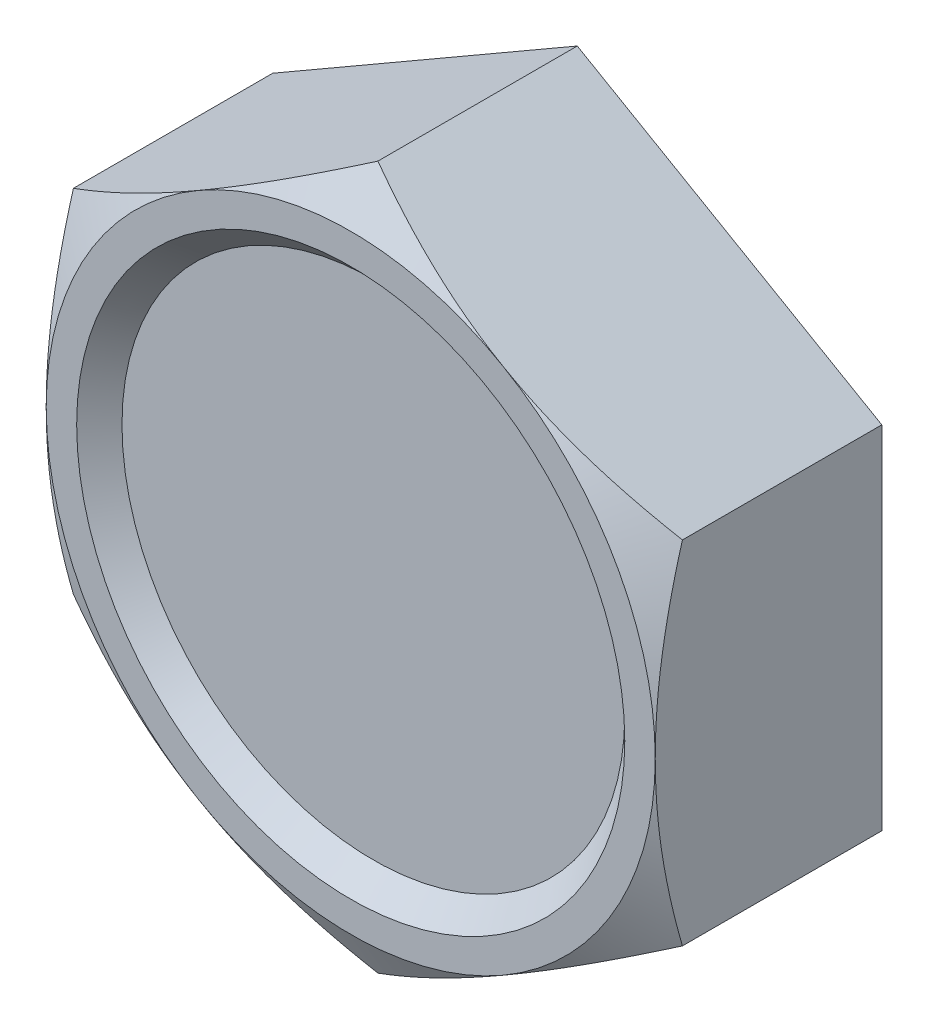
ISO-10303-21;
HEADER;
FILE_DESCRIPTION(('STEP AP214'),'2;1');
FILE_NAME('part.step','',(''),(''),'','','');
FILE_SCHEMA(('AUTOMOTIVE_DESIGN { 1 0 10303 214 1 1 1 1 }'));
ENDSEC;
DATA;
#1=APPLICATION_CONTEXT('core data for automotive mechanical design processes');
#2=APPLICATION_PROTOCOL_DEFINITION('international standard','automotive_design',2000,#1);
#3=PRODUCT_CONTEXT('',#1,'mechanical');
#4=PRODUCT('Part','Part','',(#3));
#5=PRODUCT_RELATED_PRODUCT_CATEGORY('part','',(#4));
#6=PRODUCT_DEFINITION_FORMATION('','',#4);
#7=PRODUCT_DEFINITION_CONTEXT('part definition',#1,'design');
#8=PRODUCT_DEFINITION('design','',#6,#7);
#9=PRODUCT_DEFINITION_SHAPE('','',#8);
#10=(LENGTH_UNIT() NAMED_UNIT(*) SI_UNIT(.MILLI.,.METRE.));
#11=(NAMED_UNIT(*) PLANE_ANGLE_UNIT() SI_UNIT($,.RADIAN.));
#12=(NAMED_UNIT(*) SI_UNIT($,.STERADIAN.) SOLID_ANGLE_UNIT());
#13=UNCERTAINTY_MEASURE_WITH_UNIT(LENGTH_MEASURE(1.E-05),#10,'distance_accuracy_value','');
#14=(GEOMETRIC_REPRESENTATION_CONTEXT(3) GLOBAL_UNCERTAINTY_ASSIGNED_CONTEXT((#13)) GLOBAL_UNIT_ASSIGNED_CONTEXT((#10,
#11,#12)) REPRESENTATION_CONTEXT('',''));
#15=CARTESIAN_POINT('',(0.,0.,0.));
#16=DIRECTION('',(0.,0.,1.));
#17=DIRECTION('',(1.,0.,0.));
#18=AXIS2_PLACEMENT_3D('',#15,#16,#17);
#19=CARTESIAN_POINT('',(0.,0.,2.12598));
#20=DIRECTION('',(0.,0.,1.));
#21=DIRECTION('',(1.,0.,0.));
#22=AXIS2_PLACEMENT_3D('',#19,#20,#21);
#23=PLANE('',#22);
#24=CARTESIAN_POINT('',(0.,0.,2.12597999995978));
#25=DIRECTION('',(0.,0.,1.));
#26=DIRECTION('',(1.,0.,0.));
#27=AXIS2_PLACEMENT_3D('',#24,#25,#26);
#28=CIRCLE('',#27,2.62127999997119);
#29=CARTESIAN_POINT('',(2.62127999997119,0.,2.12597999995978));
#30=VERTEX_POINT('',#29);
#31=EDGE_CURVE('E20',#30,#30,#28,.T.);
#32=ORIENTED_EDGE('',*,*,#31,.T.);
#33=EDGE_LOOP('',(#32));
#34=FACE_BOUND('',#33,.T.);
#35=ADVANCED_FACE('F17',(#34),#23,.T.);
#36=CARTESIAN_POINT('',(0.,0.,2.36219999999321));
#37=DIRECTION('',(0.,0.,1.));
#38=DIRECTION('',(1.,0.,0.));
#39=AXIS2_PLACEMENT_3D('',#36,#37,#38);
#40=CONICAL_SURFACE('',#39,2.85750000006146,0.785398163517767);
#41=ORIENTED_EDGE('',*,*,#31,.F.);
#42=EDGE_LOOP('',(#41));
#43=FACE_BOUND('',#42,.T.);
#44=CARTESIAN_POINT('',(0.,0.,2.36219999999321));
#45=DIRECTION('',(0.,0.,1.));
#46=DIRECTION('',(1.,0.,0.));
#47=AXIS2_PLACEMENT_3D('',#44,#45,#46);
#48=CIRCLE('',#47,2.85750000006146);
#49=CARTESIAN_POINT('',(2.85750000006146,0.,2.36219999999321));
#50=VERTEX_POINT('',#49);
#51=EDGE_CURVE('E112',#50,#50,#48,.T.);
#52=ORIENTED_EDGE('',*,*,#51,.T.);
#53=EDGE_LOOP('',(#52));
#54=FACE_BOUND('',#53,.T.);
#55=ADVANCED_FACE('F331',(#43,#54),#40,.F.);
#56=CARTESIAN_POINT('',(-3.175,5.49926131403094,2.3622));
#57=DIRECTION('',(0.,0.,-1.));
#58=DIRECTION('',(-1.,0.,0.));
#59=AXIS2_PLACEMENT_3D('',#56,#57,#58);
#60=PLANE('',#59);
#61=ORIENTED_EDGE('',*,*,#51,.F.);
#62=EDGE_LOOP('',(#61));
#63=FACE_BOUND('',#62,.T.);
#64=CARTESIAN_POINT('',(0.,0.,2.36219999998441));
#65=DIRECTION('',(0.,0.,-1.));
#66=DIRECTION('',(-1.,0.,0.));
#67=AXIS2_PLACEMENT_3D('',#64,#65,#66);
#68=CIRCLE('',#67,3.17499999999882);
#69=CARTESIAN_POINT('',(1.58749999999944,-2.74963065701513,2.36219999998441));
#70=VERTEX_POINT('',#69);
#71=CARTESIAN_POINT('',(-1.5874999999992,-2.74963065701535,2.36219999998408));
#72=VERTEX_POINT('',#71);
#73=EDGE_CURVE('E321',#70,#72,#68,.T.);
#74=ORIENTED_EDGE('',*,*,#73,.F.);
#75=CARTESIAN_POINT('',(0.,0.,2.36219999998441));
#76=DIRECTION('',(0.,0.,-1.));
#77=DIRECTION('',(-1.,0.,0.));
#78=AXIS2_PLACEMENT_3D('',#75,#76,#77);
#79=CIRCLE('',#78,3.17499999999882);
#80=CARTESIAN_POINT('',(3.17499999999941,0.,2.36219999998407));
#81=VERTEX_POINT('',#80);
#82=EDGE_CURVE('E92',#81,#70,#79,.T.);
#83=ORIENTED_EDGE('',*,*,#82,.F.);
#84=CARTESIAN_POINT('',(0.,0.,2.36219999998441));
#85=DIRECTION('',(0.,0.,-1.));
#86=DIRECTION('',(-1.,0.,0.));
#87=AXIS2_PLACEMENT_3D('',#84,#85,#86);
#88=CIRCLE('',#87,3.17499999999882);
#89=CARTESIAN_POINT('',(1.5874999999992,2.74963065701535,2.36219999998408));
#90=VERTEX_POINT('',#89);
#91=EDGE_CURVE('E88',#90,#81,#88,.T.);
#92=ORIENTED_EDGE('',*,*,#91,.F.);
#93=CARTESIAN_POINT('',(0.,0.,2.36219999998441));
#94=DIRECTION('',(0.,0.,-1.));
#95=DIRECTION('',(-1.,0.,0.));
#96=AXIS2_PLACEMENT_3D('',#93,#94,#95);
#97=CIRCLE('',#96,3.17499999999882);
#98=CARTESIAN_POINT('',(-1.58749999999944,2.74963065701513,2.36219999998441));
#99=VERTEX_POINT('',#98);
#100=EDGE_CURVE('E85',#99,#90,#97,.T.);
#101=ORIENTED_EDGE('',*,*,#100,.F.);
#102=CARTESIAN_POINT('',(0.,0.,2.36219999998441));
#103=DIRECTION('',(0.,0.,-1.));
#104=DIRECTION('',(-1.,0.,0.));
#105=AXIS2_PLACEMENT_3D('',#102,#103,#104);
#106=CIRCLE('',#105,3.17499999999882);
#107=CARTESIAN_POINT('',(-3.17499999999941,0.,2.36219999998407));
#108=VERTEX_POINT('',#107);
#109=EDGE_CURVE('E311',#108,#99,#106,.T.);
#110=ORIENTED_EDGE('',*,*,#109,.F.);
#111=CARTESIAN_POINT('',(0.,0.,2.36219999998441));
#112=DIRECTION('',(0.,0.,-1.));
#113=DIRECTION('',(-1.,0.,0.));
#114=AXIS2_PLACEMENT_3D('',#111,#112,#113);
#115=CIRCLE('',#114,3.17499999999882);
#116=EDGE_CURVE('E154',#72,#108,#115,.T.);
#117=ORIENTED_EDGE('',*,*,#116,.F.);
#118=EDGE_LOOP('',(#74,#83,#92,#101,#110,#117));
#119=FACE_BOUND('',#118,.T.);
#120=ADVANCED_FACE('F90',(#63,#119),#60,.F.);
#121=CARTESIAN_POINT('',(0.,0.,2.07691896071083));
#122=DIRECTION('',(0.,0.,-1.));
#123=DIRECTION('',(-1.,0.,0.));
#124=AXIS2_PLACEMENT_3D('',#121,#122,#123);
#125=CONICAL_SURFACE('',#124,3.66912125446106,1.0471975512004);
#126=ORIENTED_EDGE('',*,*,#100,.T.);
#127=CARTESIAN_POINT('',(1.58749999999949,2.74963065701585,2.36219999998375));
#128=CARTESIAN_POINT('',(1.52011953073776,2.78853278908223,2.36221297609043));
#129=CARTESIAN_POINT('',(1.4527423074217,2.82743304710101,2.36054913303606));
#130=CARTESIAN_POINT('',(1.31812015692402,2.90515718192974,2.3539642536552));
#131=CARTESIAN_POINT('',(1.25087520619467,2.94398107233497,2.34904386215013));
#132=CARTESIAN_POINT('',(1.11695194988545,3.02130170041585,2.33607473147119));
#133=CARTESIAN_POINT('',(1.05027249167432,3.05979910356347,2.32804174109907));
#134=CARTESIAN_POINT('',(0.917231259257786,3.13661049491248,2.30902020538231));
#135=CARTESIAN_POINT('',(0.85086949346109,3.1749244782591,2.29803158224317));
#136=CARTESIAN_POINT('',(0.652535809724929,3.28943248395355,2.26097173116333));
#137=CARTESIAN_POINT('',(0.521140058568112,3.36529385625431,2.23078852633765));
#138=CARTESIAN_POINT('',(0.259478502014596,3.51636422636707,2.16117833593345));
#139=CARTESIAN_POINT('',(0.12922182360895,3.59156795470832,2.12170518531732));
#140=CARTESIAN_POINT('',(3.24476093886402E-12,3.66617420935225,2.0786204379977));
#141=B_SPLINE_CURVE_WITH_KNOTS('',3,(#127,#128,#129,#130,#131,#132,#133,#134,#135,#136,#137,
#138,#139,#140),.UNSPECIFIED.,.F.,.F.,(4,2,2,2,2,2,4),(0.,0.2333889721971,0.466731745418666,
0.698908975801317,0.93109231786327,1.39485045436759,1.86096373244441),.UNSPECIFIED.);
#142=CARTESIAN_POINT('',(0.,3.66617420935221,2.07862043799772));
#143=VERTEX_POINT('',#142);
#144=EDGE_CURVE('E104',#90,#143,#141,.T.);
#145=ORIENTED_EDGE('',*,*,#144,.T.);
#146=CARTESIAN_POINT('',(-3.09956433173275E-12,3.66617420935217,2.07862043799774));
#147=CARTESIAN_POINT('',(-0.12922182360881,3.59156795470824,2.12170518531737));
#148=CARTESIAN_POINT('',(-0.259478502014462,3.51636422636698,2.1611783359335));
#149=CARTESIAN_POINT('',(-0.52114005856799,3.36529385625422,2.23078852633772));
#150=CARTESIAN_POINT('',(-0.652535809724813,3.28943248395345,2.2609717311634));
#151=CARTESIAN_POINT('',(-0.850869493460984,3.174924478259,2.29803158224324));
#152=CARTESIAN_POINT('',(-0.917231259257682,3.13661049491237,2.30902020538238));
#153=CARTESIAN_POINT('',(-1.05027249167422,3.05979910356336,2.32804174109914));
#154=CARTESIAN_POINT('',(-1.11695194988535,3.02130170041574,2.33607473147126));
#155=CARTESIAN_POINT('',(-1.25087520619458,2.94398107233486,2.34904386215021));
#156=CARTESIAN_POINT('',(-1.31812015692393,2.90515718192962,2.35396425365528));
#157=CARTESIAN_POINT('',(-1.45274230742162,2.82743304710089,2.36054913303614));
#158=CARTESIAN_POINT('',(-1.52011953073769,2.78853278908211,2.36221297609051));
#159=CARTESIAN_POINT('',(-1.58749999999941,2.74963065701573,2.36219999998383));
#160=B_SPLINE_CURVE_WITH_KNOTS('',3,(#146,#147,#148,#149,#150,#151,#152,#153,#154,#155,#156,
#157,#158,#159),.UNSPECIFIED.,.F.,.F.,(4,2,2,2,2,2,4),(0.,0.466113278076845,0.929871414581184,
1.16205475664315,1.39423198702581,1.62757476024739,1.8609637324445),.UNSPECIFIED.);
#161=EDGE_CURVE('E110',#143,#99,#160,.T.);
#162=ORIENTED_EDGE('',*,*,#161,.T.);
#163=EDGE_LOOP('',(#126,#145,#162));
#164=FACE_BOUND('',#163,.T.);
#165=ADVANCED_FACE('F108',(#164),#125,.T.);
#166=CARTESIAN_POINT('',(0.,0.,2.07691896071083));
#167=DIRECTION('',(0.,0.,-1.));
#168=DIRECTION('',(-1.,0.,0.));
#169=AXIS2_PLACEMENT_3D('',#166,#167,#168);
#170=CONICAL_SURFACE('',#169,3.66912125446106,1.0471975512004);
#171=ORIENTED_EDGE('',*,*,#91,.T.);
#172=CARTESIAN_POINT('',(3.175,0.,2.36219999998373));
#173=CARTESIAN_POINT('',(3.175,0.0778042641327814,2.36221297609042));
#174=CARTESIAN_POINT('',(3.175,0.155604780170365,2.36054913303605));
#175=CARTESIAN_POINT('',(3.175,0.311053049827864,2.35396425365521));
#176=CARTESIAN_POINT('',(3.175,0.388700830638356,2.34904386215015));
#177=CARTESIAN_POINT('',(3.175,0.543342086800161,2.33607473147121));
#178=CARTESIAN_POINT('',(3.175,0.620336893095415,2.32804174109909));
#179=CARTESIAN_POINT('',(3.175,0.773959675793474,2.30902020538234));
#180=CARTESIAN_POINT('',(3.175,0.850587642486741,2.29803158224321));
#181=CARTESIAN_POINT('',(3.175,1.0796036538757,2.26097173116336));
#182=CARTESIAN_POINT('',(3.175,1.23132639847727,2.23078852633769));
#183=CARTESIAN_POINT('',(3.175,1.53346713870287,2.16117833593347));
#184=CARTESIAN_POINT('',(3.175,1.68387459538541,2.12170518531734));
#185=CARTESIAN_POINT('',(3.175,1.83308710467331,2.0786204379977));
#186=B_SPLINE_CURVE_WITH_KNOTS('',3,(#172,#173,#174,#175,#176,#177,#178,#179,#180,#181,#182,
#183,#184,#185),.UNSPECIFIED.,.F.,.F.,(4,2,2,2,2,2,4),(0.,0.233388972197173,0.46673174541881,
0.698908975801532,0.931092317863555,1.39485045436801,1.86096373244498),.UNSPECIFIED.);
#187=CARTESIAN_POINT('',(3.17499999999841,1.83308710467606,2.0786204379977));
#188=VERTEX_POINT('',#187);
#189=EDGE_CURVE('E100',#81,#188,#186,.T.);
#190=ORIENTED_EDGE('',*,*,#189,.T.);
#191=CARTESIAN_POINT('',(3.17499999999683,1.83308710467881,2.0786204379977));
#192=CARTESIAN_POINT('',(3.04577817639103,1.9076933593228,2.12170518531735));
#193=CARTESIAN_POINT('',(2.9155214979853,1.9828970876641,2.1611783359335));
#194=CARTESIAN_POINT('',(2.6538599414316,2.13396745777696,2.23078852633774));
#195=CARTESIAN_POINT('',(2.52246419027469,2.20982883007777,2.26097173116343));
#196=CARTESIAN_POINT('',(2.32413050653839,2.3243368357723,2.29803158224327));
#197=CARTESIAN_POINT('',(2.25776874074165,2.36265081911895,2.30902020538241));
#198=CARTESIAN_POINT('',(2.12472750832503,2.43946221046801,2.32804174109916));
#199=CARTESIAN_POINT('',(2.05804805011385,2.47795961361566,2.33607473147127));
#200=CARTESIAN_POINT('',(1.92412479380454,2.55528024169659,2.3490438621502));
#201=CARTESIAN_POINT('',(1.85687984307514,2.59410413210185,2.35396425365526));
#202=CARTESIAN_POINT('',(1.72225769257736,2.67182826693063,2.36054913303609));
#203=CARTESIAN_POINT('',(1.65488046926125,2.71072852494944,2.36221297609045));
#204=CARTESIAN_POINT('',(1.58749999999949,2.74963065701585,2.36219999998375));
#205=B_SPLINE_CURVE_WITH_KNOTS('',3,(#191,#192,#193,#194,#195,#196,#197,#198,#199,#200,#201,
#202,#203,#204),.UNSPECIFIED.,.F.,.F.,(4,2,2,2,2,2,4),(0.,0.466113278077142,0.929871414581771,
1.16205475664388,1.39423198702669,1.62757476024842,1.86096373244568),.UNSPECIFIED.);
#206=EDGE_CURVE('E98',#188,#90,#205,.T.);
#207=ORIENTED_EDGE('',*,*,#206,.T.);
#208=EDGE_LOOP('',(#171,#190,#207));
#209=FACE_BOUND('',#208,.T.);
#210=ADVANCED_FACE('F99',(#209),#170,.T.);
#211=CARTESIAN_POINT('',(0.,0.,2.07691896071083));
#212=DIRECTION('',(0.,0.,-1.));
#213=DIRECTION('',(-1.,0.,0.));
#214=AXIS2_PLACEMENT_3D('',#211,#212,#213);
#215=CONICAL_SURFACE('',#214,3.66912125446106,1.0471975512004);
#216=ORIENTED_EDGE('',*,*,#82,.T.);
#217=CARTESIAN_POINT('',(1.58749999999942,-2.74963065701573,2.36219999998383));
#218=CARTESIAN_POINT('',(1.65488046926118,-2.71072852494932,2.36221297609053));
#219=CARTESIAN_POINT('',(1.72225769257729,-2.67182826693052,2.36054913303617));
#220=CARTESIAN_POINT('',(1.85687984307506,-2.59410413210174,2.35396425365534));
#221=CARTESIAN_POINT('',(1.92412479380445,-2.55528024169648,2.34904386215028));
#222=CARTESIAN_POINT('',(2.05804805011375,-2.47795961361555,2.33607473147136));
#223=CARTESIAN_POINT('',(2.12472750832493,-2.43946221046791,2.32804174109924));
#224=CARTESIAN_POINT('',(2.25776874074154,-2.36265081911885,2.30902020538249));
#225=CARTESIAN_POINT('',(2.32413050653828,-2.3243368357722,2.29803158224336));
#226=CARTESIAN_POINT('',(2.52246419027457,-2.20982883007768,2.26097173116351));
#227=CARTESIAN_POINT('',(2.65385994143147,-2.13396745777687,2.23078852633783));
#228=CARTESIAN_POINT('',(2.91552149798515,-1.98289708766402,2.16117833593359));
#229=CARTESIAN_POINT('',(3.04577817639088,-1.90769335932272,2.12170518531745));
#230=CARTESIAN_POINT('',(3.17499999999667,-1.83308710467874,2.0786204379978));
#231=B_SPLINE_CURVE_WITH_KNOTS('',3,(#217,#218,#219,#220,#221,#222,#223,#224,#225,#226,#227,
#228,#229,#230),.UNSPECIFIED.,.F.,.F.,(4,2,2,2,2,2,4),(0.,0.233388972197249,0.466731745418962,
0.698908975801758,0.931092317863855,1.39485045436846,1.86096373244558),.UNSPECIFIED.);
#232=CARTESIAN_POINT('',(3.17499999999833,-1.83308710467606,2.07862043799774));
#233=VERTEX_POINT('',#232);
#234=EDGE_CURVE('E234',#70,#233,#231,.T.);
#235=ORIENTED_EDGE('',*,*,#234,.T.);
#236=CARTESIAN_POINT('',(3.175,-1.83308710467337,2.07862043799768));
#237=CARTESIAN_POINT('',(3.175,-1.68387459538547,2.12170518531732));
#238=CARTESIAN_POINT('',(3.175,-1.53346713870292,2.16117833593345));
#239=CARTESIAN_POINT('',(3.175,-1.23132639847731,2.23078852633768));
#240=CARTESIAN_POINT('',(3.175,-1.07960365387574,2.26097173116336));
#241=CARTESIAN_POINT('',(3.175,-0.85058764248677,2.2980315822432));
#242=CARTESIAN_POINT('',(3.175,-0.7739596757935,2.30902020538234));
#243=CARTESIAN_POINT('',(3.175,-0.620336893095436,2.32804174109909));
#244=CARTESIAN_POINT('',(3.175,-0.543342086800179,2.33607473147121));
#245=CARTESIAN_POINT('',(3.175,-0.388700830638369,2.34904386215015));
#246=CARTESIAN_POINT('',(3.175,-0.311053049827875,2.35396425365521));
#247=CARTESIAN_POINT('',(3.175,-0.15560478017037,2.36054913303605));
#248=CARTESIAN_POINT('',(3.175,-0.0778042641327839,2.36221297609042));
#249=CARTESIAN_POINT('',(3.175,0.,2.36219999998373));
#250=B_SPLINE_CURVE_WITH_KNOTS('',3,(#236,#237,#238,#239,#240,#241,#242,#243,#244,#245,#246,
#247,#248,#249),.UNSPECIFIED.,.F.,.F.,(4,2,2,2,2,2,4),(0.,0.466113278076981,0.929871414581454,
1.16205475664349,1.39423198702621,1.62757476024786,1.86096373244504),.UNSPECIFIED.);
#251=EDGE_CURVE('E119',#233,#81,#250,.T.);
#252=ORIENTED_EDGE('',*,*,#251,.T.);
#253=EDGE_LOOP('',(#216,#235,#252));
#254=FACE_BOUND('',#253,.T.);
#255=ADVANCED_FACE('F223',(#254),#215,.T.);
#256=CARTESIAN_POINT('',(0.,0.,2.07691896071083));
#257=DIRECTION('',(0.,0.,-1.));
#258=DIRECTION('',(-1.,0.,0.));
#259=AXIS2_PLACEMENT_3D('',#256,#257,#258);
#260=CONICAL_SURFACE('',#259,3.66912125446106,1.0471975512004);
#261=ORIENTED_EDGE('',*,*,#73,.T.);
#262=CARTESIAN_POINT('',(-1.58749999999949,-2.74963065701585,2.36219999998375));
#263=CARTESIAN_POINT('',(-1.52011953073776,-2.78853278908223,2.36221297609043));
#264=CARTESIAN_POINT('',(-1.4527423074217,-2.82743304710101,2.36054913303606));
#265=CARTESIAN_POINT('',(-1.31812015692402,-2.90515718192974,2.3539642536552));
#266=CARTESIAN_POINT('',(-1.25087520619467,-2.94398107233497,2.34904386215013));
#267=CARTESIAN_POINT('',(-1.11695194988545,-3.02130170041585,2.33607473147119));
#268=CARTESIAN_POINT('',(-1.05027249167432,-3.05979910356347,2.32804174109907));
#269=CARTESIAN_POINT('',(-0.917231259257786,-3.13661049491248,2.30902020538231));
#270=CARTESIAN_POINT('',(-0.850869493461091,-3.1749244782591,2.29803158224317));
#271=CARTESIAN_POINT('',(-0.652535809724929,-3.28943248395355,2.26097173116333));
#272=CARTESIAN_POINT('',(-0.521140058568113,-3.36529385625431,2.23078852633765));
#273=CARTESIAN_POINT('',(-0.259478502014596,-3.51636422636707,2.16117833593344));
#274=CARTESIAN_POINT('',(-0.12922182360895,-3.59156795470832,2.12170518531732));
#275=CARTESIAN_POINT('',(-3.24517887790506E-12,-3.66617420935225,2.0786204379977));
#276=B_SPLINE_CURVE_WITH_KNOTS('',3,(#262,#263,#264,#265,#266,#267,#268,#269,#270,#271,#272,
#273,#274,#275),.UNSPECIFIED.,.F.,.F.,(4,2,2,2,2,2,4),(0.,0.2333889721971,0.466731745418666,
0.698908975801317,0.93109231786327,1.39485045436759,1.86096373244441),.UNSPECIFIED.);
#277=CARTESIAN_POINT('',(0.,-3.66617420935221,2.07862043799772));
#278=VERTEX_POINT('',#277);
#279=EDGE_CURVE('E214',#72,#278,#276,.T.);
#280=ORIENTED_EDGE('',*,*,#279,.T.);
#281=CARTESIAN_POINT('',(3.09957594858635E-12,-3.66617420935217,2.07862043799774));
#282=CARTESIAN_POINT('',(0.129221823608811,-3.59156795470824,2.12170518531737));
#283=CARTESIAN_POINT('',(0.259478502014462,-3.51636422636698,2.1611783359335));
#284=CARTESIAN_POINT('',(0.521140058567991,-3.36529385625422,2.23078852633772));
#285=CARTESIAN_POINT('',(0.652535809724813,-3.28943248395345,2.2609717311634));
#286=CARTESIAN_POINT('',(0.850869493460984,-3.174924478259,2.29803158224324));
#287=CARTESIAN_POINT('',(0.917231259257683,-3.13661049491237,2.30902020538238));
#288=CARTESIAN_POINT('',(1.05027249167422,-3.05979910356336,2.32804174109914));
#289=CARTESIAN_POINT('',(1.11695194988536,-3.02130170041574,2.33607473147126));
#290=CARTESIAN_POINT('',(1.25087520619458,-2.94398107233486,2.34904386215021));
#291=CARTESIAN_POINT('',(1.31812015692393,-2.90515718192962,2.35396425365528));
#292=CARTESIAN_POINT('',(1.45274230742162,-2.82743304710089,2.36054913303614));
#293=CARTESIAN_POINT('',(1.52011953073769,-2.78853278908211,2.36221297609051));
#294=CARTESIAN_POINT('',(1.58749999999942,-2.74963065701573,2.36219999998383));
#295=B_SPLINE_CURVE_WITH_KNOTS('',3,(#281,#282,#283,#284,#285,#286,#287,#288,#289,#290,#291,
#292,#293,#294),.UNSPECIFIED.,.F.,.F.,(4,2,2,2,2,2,4),(0.,0.466113278076846,0.929871414581184,
1.16205475664315,1.39423198702581,1.62757476024739,1.8609637324445),.UNSPECIFIED.);
#296=EDGE_CURVE('E228',#278,#70,#295,.T.);
#297=ORIENTED_EDGE('',*,*,#296,.T.);
#298=EDGE_LOOP('',(#261,#280,#297));
#299=FACE_BOUND('',#298,.T.);
#300=ADVANCED_FACE('F220',(#299),#260,.T.);
#301=CARTESIAN_POINT('',(0.,0.,2.07691896071083));
#302=DIRECTION('',(0.,0.,-1.));
#303=DIRECTION('',(-1.,0.,0.));
#304=AXIS2_PLACEMENT_3D('',#301,#302,#303);
#305=CONICAL_SURFACE('',#304,3.66912125446106,1.0471975512004);
#306=CARTESIAN_POINT('',(-1.58749999999942,2.74963065701573,2.36219999998383));
#307=CARTESIAN_POINT('',(-1.65488046926118,2.71072852494932,2.36221297609053));
#308=CARTESIAN_POINT('',(-1.7222576925773,2.67182826693051,2.36054913303617));
#309=CARTESIAN_POINT('',(-1.85687984307508,2.59410413210173,2.35396425365534));
#310=CARTESIAN_POINT('',(-1.92412479380447,2.55528024169646,2.34904386215028));
#311=CARTESIAN_POINT('',(-2.05804805011378,2.47795961361553,2.33607473147135));
#312=CARTESIAN_POINT('',(-2.12472750832496,2.43946221046789,2.32804174109924));
#313=CARTESIAN_POINT('',(-2.25776874074159,2.36265081911882,2.30902020538249));
#314=CARTESIAN_POINT('',(-2.32413050653833,2.32433683577217,2.29803158224335));
#315=CARTESIAN_POINT('',(-2.52246419027463,2.20982883007765,2.2609717311635));
#316=CARTESIAN_POINT('',(-2.65385994143154,2.13396745777683,2.23078852633782));
#317=CARTESIAN_POINT('',(-2.91552149798524,1.98289708766397,2.16117833593357));
#318=CARTESIAN_POINT('',(-3.04577817639098,1.90769335932266,2.12170518531742));
#319=CARTESIAN_POINT('',(-3.17499999999677,1.83308710467868,2.07862043799776));
#320=B_SPLINE_CURVE_WITH_KNOTS('',3,(#306,#307,#308,#309,#310,#311,#312,#313,#314,#315,#316,
#317,#318,#319),.UNSPECIFIED.,.F.,.F.,(4,2,2,2,2,2,4),(0.,0.233388972197264,0.466731745418992,
0.698908975801803,0.931092317863916,1.39485045436855,1.8609637324457),.UNSPECIFIED.);
#321=CARTESIAN_POINT('',(-3.17499999999839,1.83308710467783,2.0786204379972));
#322=VERTEX_POINT('',#321);
#323=EDGE_CURVE('E105',#99,#322,#320,.T.);
#324=ORIENTED_EDGE('',*,*,#323,.T.);
#325=CARTESIAN_POINT('',(-3.175,1.83308710467327,2.07862043799771));
#326=CARTESIAN_POINT('',(-3.175,1.68387459538537,2.12170518531735));
#327=CARTESIAN_POINT('',(-3.175,1.53346713870283,2.16117833593348));
#328=CARTESIAN_POINT('',(-3.175,1.23132639847724,2.23078852633769));
#329=CARTESIAN_POINT('',(-3.175,1.07960365387567,2.26097173116337));
#330=CARTESIAN_POINT('',(-3.175,0.850587642486719,2.29803158224321));
#331=CARTESIAN_POINT('',(-3.175,0.773959675793454,2.30902020538235));
#332=CARTESIAN_POINT('',(-3.175,0.620336893095399,2.3280417410991));
#333=CARTESIAN_POINT('',(-3.175,0.543342086800147,2.33607473147121));
#334=CARTESIAN_POINT('',(-3.175,0.388700830638345,2.34904386215015));
#335=CARTESIAN_POINT('',(-3.175,0.311053049827855,2.35396425365521));
#336=CARTESIAN_POINT('',(-3.175,0.15560478017036,2.36054913303605));
#337=CARTESIAN_POINT('',(-3.175,0.0778042641327786,2.36221297609042));
#338=CARTESIAN_POINT('',(-3.175,0.,2.36219999998373));
#339=B_SPLINE_CURVE_WITH_KNOTS('',3,(#325,#326,#327,#328,#329,#330,#331,#332,#333,#334,#335,
#336,#337,#338),.UNSPECIFIED.,.F.,.F.,(4,2,2,2,2,2,4),(0.,0.466113278076954,0.929871414581399,
1.16205475664342,1.39423198702613,1.62757476024776,1.86096373244493),.UNSPECIFIED.);
#340=EDGE_CURVE('E193',#322,#108,#339,.T.);
#341=ORIENTED_EDGE('',*,*,#340,.T.);
#342=ORIENTED_EDGE('',*,*,#109,.T.);
#343=EDGE_LOOP('',(#324,#341,#342));
#344=FACE_BOUND('',#343,.T.);
#345=ADVANCED_FACE('F170',(#344),#305,.T.);
#346=CARTESIAN_POINT('',(0.,0.,2.07691896071083));
#347=DIRECTION('',(0.,0.,-1.));
#348=DIRECTION('',(-1.,0.,0.));
#349=AXIS2_PLACEMENT_3D('',#346,#347,#348);
#350=CONICAL_SURFACE('',#349,3.66912125446106,1.0471975512004);
#351=ORIENTED_EDGE('',*,*,#116,.T.);
#352=CARTESIAN_POINT('',(-3.175,0.,2.36219999998373));
#353=CARTESIAN_POINT('',(-3.175,-0.0778042641327815,2.36221297609042));
#354=CARTESIAN_POINT('',(-3.175,-0.155604780170365,2.36054913303605));
#355=CARTESIAN_POINT('',(-3.175,-0.311053049827864,2.35396425365521));
#356=CARTESIAN_POINT('',(-3.175,-0.388700830638356,2.34904386215015));
#357=CARTESIAN_POINT('',(-3.175,-0.543342086800161,2.33607473147121));
#358=CARTESIAN_POINT('',(-3.175,-0.620336893095415,2.32804174109909));
#359=CARTESIAN_POINT('',(-3.175,-0.773959675793474,2.30902020538234));
#360=CARTESIAN_POINT('',(-3.175,-0.850587642486741,2.29803158224321));
#361=CARTESIAN_POINT('',(-3.175,-1.0796036538757,2.26097173116336));
#362=CARTESIAN_POINT('',(-3.175,-1.23132639847727,2.23078852633769));
#363=CARTESIAN_POINT('',(-3.175,-1.53346713870287,2.16117833593347));
#364=CARTESIAN_POINT('',(-3.175,-1.68387459538541,2.12170518531734));
#365=CARTESIAN_POINT('',(-3.175,-1.83308710467331,2.0786204379977));
#366=B_SPLINE_CURVE_WITH_KNOTS('',3,(#352,#353,#354,#355,#356,#357,#358,#359,#360,#361,#362,
#363,#364,#365),.UNSPECIFIED.,.F.,.F.,(4,2,2,2,2,2,4),(0.,0.233388972197173,0.46673174541881,
0.698908975801532,0.931092317863555,1.39485045436801,1.86096373244498),.UNSPECIFIED.);
#367=CARTESIAN_POINT('',(-3.17499999999841,-1.83308710467606,2.0786204379977));
#368=VERTEX_POINT('',#367);
#369=EDGE_CURVE('E185',#108,#368,#366,.T.);
#370=ORIENTED_EDGE('',*,*,#369,.T.);
#371=CARTESIAN_POINT('',(-3.17499999999683,-1.83308710467881,2.0786204379977));
#372=CARTESIAN_POINT('',(-3.04577817639103,-1.9076933593228,2.12170518531735));
#373=CARTESIAN_POINT('',(-2.9155214979853,-1.9828970876641,2.1611783359335));
#374=CARTESIAN_POINT('',(-2.6538599414316,-2.13396745777696,2.23078852633774));
#375=CARTESIAN_POINT('',(-2.52246419027469,-2.20982883007777,2.26097173116343));
#376=CARTESIAN_POINT('',(-2.32413050653839,-2.3243368357723,2.29803158224327));
#377=CARTESIAN_POINT('',(-2.25776874074165,-2.36265081911895,2.30902020538241));
#378=CARTESIAN_POINT('',(-2.12472750832503,-2.43946221046801,2.32804174109916));
#379=CARTESIAN_POINT('',(-2.05804805011385,-2.47795961361566,2.33607473147127));
#380=CARTESIAN_POINT('',(-1.92412479380454,-2.55528024169659,2.3490438621502));
#381=CARTESIAN_POINT('',(-1.85687984307514,-2.59410413210185,2.35396425365526));
#382=CARTESIAN_POINT('',(-1.72225769257736,-2.67182826693063,2.36054913303609));
#383=CARTESIAN_POINT('',(-1.65488046926125,-2.71072852494944,2.36221297609045));
#384=CARTESIAN_POINT('',(-1.58749999999948,-2.74963065701585,2.36219999998375));
#385=B_SPLINE_CURVE_WITH_KNOTS('',3,(#371,#372,#373,#374,#375,#376,#377,#378,#379,#380,#381,
#382,#383,#384),.UNSPECIFIED.,.F.,.F.,(4,2,2,2,2,2,4),(0.,0.466113278077141,0.929871414581771,
1.16205475664388,1.39423198702669,1.62757476024842,1.86096373244568),.UNSPECIFIED.);
#386=EDGE_CURVE('E176',#368,#72,#385,.T.);
#387=ORIENTED_EDGE('',*,*,#386,.T.);
#388=EDGE_LOOP('',(#351,#370,#387));
#389=FACE_BOUND('',#388,.T.);
#390=ADVANCED_FACE('F165',(#389),#350,.T.);
#391=CARTESIAN_POINT('',(0.,3.66617420935396,2.3622));
#392=DIRECTION('',(0.500000000000017,-0.866025403784429,0.));
#393=DIRECTION('',(0.866025403784429,0.500000000000017,0.));
#394=AXIS2_PLACEMENT_3D('',#391,#392,#393);
#395=PLANE('',#394);
#396=DIRECTION('',(0.866025403784448,0.499999999999983,0.));
#397=VECTOR('',#396,1.);
#398=CARTESIAN_POINT('',(-3.175,1.83308710467698,0.));
#399=LINE('',#398,#397);
#400=CARTESIAN_POINT('',(-3.175,1.83308710467698,0.));
#401=VERTEX_POINT('',#400);
#402=CARTESIAN_POINT('',(0.,3.66617420935401,0.));
#403=VERTEX_POINT('',#402);
#404=EDGE_CURVE('E281',#401,#403,#399,.T.);
#405=ORIENTED_EDGE('',*,*,#404,.F.);
#406=DIRECTION('',(0.,0.,-1.));
#407=VECTOR('',#406,1.);
#408=CARTESIAN_POINT('',(-3.175,1.83308710467698,2.3622));
#409=LINE('',#408,#407);
#410=EDGE_CURVE('E282',#401,#322,#409,.F.);
#411=ORIENTED_EDGE('',*,*,#410,.T.);
#412=ORIENTED_EDGE('',*,*,#323,.F.);
#413=ORIENTED_EDGE('',*,*,#161,.F.);
#414=DIRECTION('',(0.,0.,1.));
#415=VECTOR('',#414,1.);
#416=CARTESIAN_POINT('',(0.,3.66617420935408,2.3622));
#417=LINE('',#416,#415);
#418=EDGE_CURVE('E117',#143,#403,#417,.F.);
#419=ORIENTED_EDGE('',*,*,#418,.T.);
#420=EDGE_LOOP('',(#405,#411,#412,#413,#419));
#421=FACE_BOUND('',#420,.T.);
#422=ADVANCED_FACE('F161',(#421),#395,.F.);
#423=CARTESIAN_POINT('',(3.175,1.83308710467698,2.3622));
#424=DIRECTION('',(-0.500000000000017,-0.866025403784429,0.));
#425=DIRECTION('',(0.866025403784429,-0.500000000000017,0.));
#426=AXIS2_PLACEMENT_3D('',#423,#424,#425);
#427=PLANE('',#426);
#428=DIRECTION('',(0.866025403784448,-0.499999999999983,0.));
#429=VECTOR('',#428,1.);
#430=CARTESIAN_POINT('',(0.,3.66617420935396,0.));
#431=LINE('',#430,#429);
#432=CARTESIAN_POINT('',(3.175,1.83308710467698,0.));
#433=VERTEX_POINT('',#432);
#434=EDGE_CURVE('E278',#403,#433,#431,.T.);
#435=ORIENTED_EDGE('',*,*,#434,.F.);
#436=ORIENTED_EDGE('',*,*,#418,.F.);
#437=ORIENTED_EDGE('',*,*,#144,.F.);
#438=ORIENTED_EDGE('',*,*,#206,.F.);
#439=DIRECTION('',(0.,0.,1.));
#440=VECTOR('',#439,1.);
#441=CARTESIAN_POINT('',(3.175,1.83308710467698,2.3622));
#442=LINE('',#441,#440);
#443=EDGE_CURVE('E235',#188,#433,#442,.F.);
#444=ORIENTED_EDGE('',*,*,#443,.T.);
#445=EDGE_LOOP('',(#435,#436,#437,#438,#444));
#446=FACE_BOUND('',#445,.T.);
#447=ADVANCED_FACE('F116',(#446),#427,.F.);
#448=CARTESIAN_POINT('',(3.175,-1.83308710467698,2.3622));
#449=DIRECTION('',(-1.,0.,0.));
#450=DIRECTION('',(0.,0.,1.));
#451=AXIS2_PLACEMENT_3D('',#448,#449,#450);
#452=PLANE('',#451);
#453=DIRECTION('',(0.,1.,0.));
#454=VECTOR('',#453,1.);
#455=CARTESIAN_POINT('',(3.175,5.49926131403094,0.));
#456=LINE('',#455,#454);
#457=CARTESIAN_POINT('',(3.1749999999999,-1.83308710467696,0.));
#458=VERTEX_POINT('',#457);
#459=EDGE_CURVE('E268',#433,#458,#456,.F.);
#460=ORIENTED_EDGE('',*,*,#459,.F.);
#461=ORIENTED_EDGE('',*,*,#443,.F.);
#462=ORIENTED_EDGE('',*,*,#189,.F.);
#463=ORIENTED_EDGE('',*,*,#251,.F.);
#464=DIRECTION('',(0.,0.,1.));
#465=VECTOR('',#464,1.);
#466=CARTESIAN_POINT('',(3.17499999999982,-1.83308710467692,2.3622));
#467=LINE('',#466,#465);
#468=EDGE_CURVE('E297',#233,#458,#467,.F.);
#469=ORIENTED_EDGE('',*,*,#468,.T.);
#470=EDGE_LOOP('',(#460,#461,#462,#463,#469));
#471=FACE_BOUND('',#470,.T.);
#472=ADVANCED_FACE('F244',(#471),#452,.F.);
#473=CARTESIAN_POINT('',(0.,-3.66617420935396,2.3622));
#474=DIRECTION('',(-0.500000000000017,0.866025403784429,0.));
#475=DIRECTION('',(-0.866025403784429,-0.500000000000017,0.));
#476=AXIS2_PLACEMENT_3D('',#473,#474,#475);
#477=PLANE('',#476);
#478=DIRECTION('',(-0.866025403784448,-0.499999999999983,0.));
#479=VECTOR('',#478,1.);
#480=CARTESIAN_POINT('',(3.175,-1.83308710467698,0.));
#481=LINE('',#480,#479);
#482=CARTESIAN_POINT('',(0.,-3.66617420935402,0.));
#483=VERTEX_POINT('',#482);
#484=EDGE_CURVE('E265',#458,#483,#481,.T.);
#485=ORIENTED_EDGE('',*,*,#484,.F.);
#486=ORIENTED_EDGE('',*,*,#468,.F.);
#487=ORIENTED_EDGE('',*,*,#234,.F.);
#488=ORIENTED_EDGE('',*,*,#296,.F.);
#489=DIRECTION('',(0.,0.,1.));
#490=VECTOR('',#489,1.);
#491=CARTESIAN_POINT('',(0.,-3.66617420935408,2.3622));
#492=LINE('',#491,#490);
#493=EDGE_CURVE('E219',#278,#483,#492,.F.);
#494=ORIENTED_EDGE('',*,*,#493,.T.);
#495=EDGE_LOOP('',(#485,#486,#487,#488,#494));
#496=FACE_BOUND('',#495,.T.);
#497=ADVANCED_FACE('F211',(#496),#477,.F.);
#498=CARTESIAN_POINT('',(-3.175,-1.83308710467698,2.3622));
#499=DIRECTION('',(0.500000000000017,0.866025403784429,0.));
#500=DIRECTION('',(-0.866025403784429,0.500000000000017,0.));
#501=AXIS2_PLACEMENT_3D('',#498,#499,#500);
#502=PLANE('',#501);
#503=DIRECTION('',(-0.866025403784448,0.499999999999983,0.));
#504=VECTOR('',#503,1.);
#505=CARTESIAN_POINT('',(0.,-3.66617420935396,0.));
#506=LINE('',#505,#504);
#507=CARTESIAN_POINT('',(-3.175,-1.83308710467698,0.));
#508=VERTEX_POINT('',#507);
#509=EDGE_CURVE('E26',#483,#508,#506,.T.);
#510=ORIENTED_EDGE('',*,*,#509,.F.);
#511=ORIENTED_EDGE('',*,*,#493,.F.);
#512=ORIENTED_EDGE('',*,*,#279,.F.);
#513=ORIENTED_EDGE('',*,*,#386,.F.);
#514=DIRECTION('',(0.,0.,-1.));
#515=VECTOR('',#514,1.);
#516=CARTESIAN_POINT('',(-3.175,-1.83308710467698,2.3622));
#517=LINE('',#516,#515);
#518=EDGE_CURVE('E35',#368,#508,#517,.T.);
#519=ORIENTED_EDGE('',*,*,#518,.T.);
#520=EDGE_LOOP('',(#510,#511,#512,#513,#519));
#521=FACE_BOUND('',#520,.T.);
#522=ADVANCED_FACE('F205',(#521),#502,.F.);
#523=CARTESIAN_POINT('',(-3.175,1.83308710467698,2.3622));
#524=DIRECTION('',(1.,0.,0.));
#525=DIRECTION('',(0.,0.,-1.));
#526=AXIS2_PLACEMENT_3D('',#523,#524,#525);
#527=PLANE('',#526);
#528=DIRECTION('',(0.,1.,0.));
#529=VECTOR('',#528,1.);
#530=CARTESIAN_POINT('',(-3.175,5.49926131403094,0.));
#531=LINE('',#530,#529);
#532=EDGE_CURVE('E11',#508,#401,#531,.T.);
#533=ORIENTED_EDGE('',*,*,#532,.F.);
#534=ORIENTED_EDGE('',*,*,#518,.F.);
#535=ORIENTED_EDGE('',*,*,#369,.F.);
#536=ORIENTED_EDGE('',*,*,#340,.F.);
#537=ORIENTED_EDGE('',*,*,#410,.F.);
#538=EDGE_LOOP('',(#533,#534,#535,#536,#537));
#539=FACE_BOUND('',#538,.T.);
#540=ADVANCED_FACE('F200',(#539),#527,.F.);
#541=CARTESIAN_POINT('',(-3.175,5.49926131403094,0.));
#542=DIRECTION('',(0.,0.,-1.));
#543=DIRECTION('',(-1.,0.,0.));
#544=AXIS2_PLACEMENT_3D('',#541,#542,#543);
#545=PLANE('',#544);
#546=ORIENTED_EDGE('',*,*,#509,.T.);
#547=ORIENTED_EDGE('',*,*,#532,.T.);
#548=ORIENTED_EDGE('',*,*,#404,.T.);
#549=ORIENTED_EDGE('',*,*,#434,.T.);
#550=ORIENTED_EDGE('',*,*,#459,.T.);
#551=ORIENTED_EDGE('',*,*,#484,.T.);
#552=EDGE_LOOP('',(#546,#547,#548,#549,#550,#551));
#553=FACE_BOUND('',#552,.T.);
#554=ADVANCED_FACE('F204',(#553),#545,.T.);
#555=CLOSED_SHELL('',(#35,#55,#120,#165,#210,#255,#300,#345,#390,#422,#447,#472,#497,#522,#540,#554));
#556=MANIFOLD_SOLID_BREP('B1',#555);
#557=ADVANCED_BREP_SHAPE_REPRESENTATION('',(#18,#556),#14);
#558=SHAPE_DEFINITION_REPRESENTATION(#9,#557);
ENDSEC;
END-ISO-10303-21;
